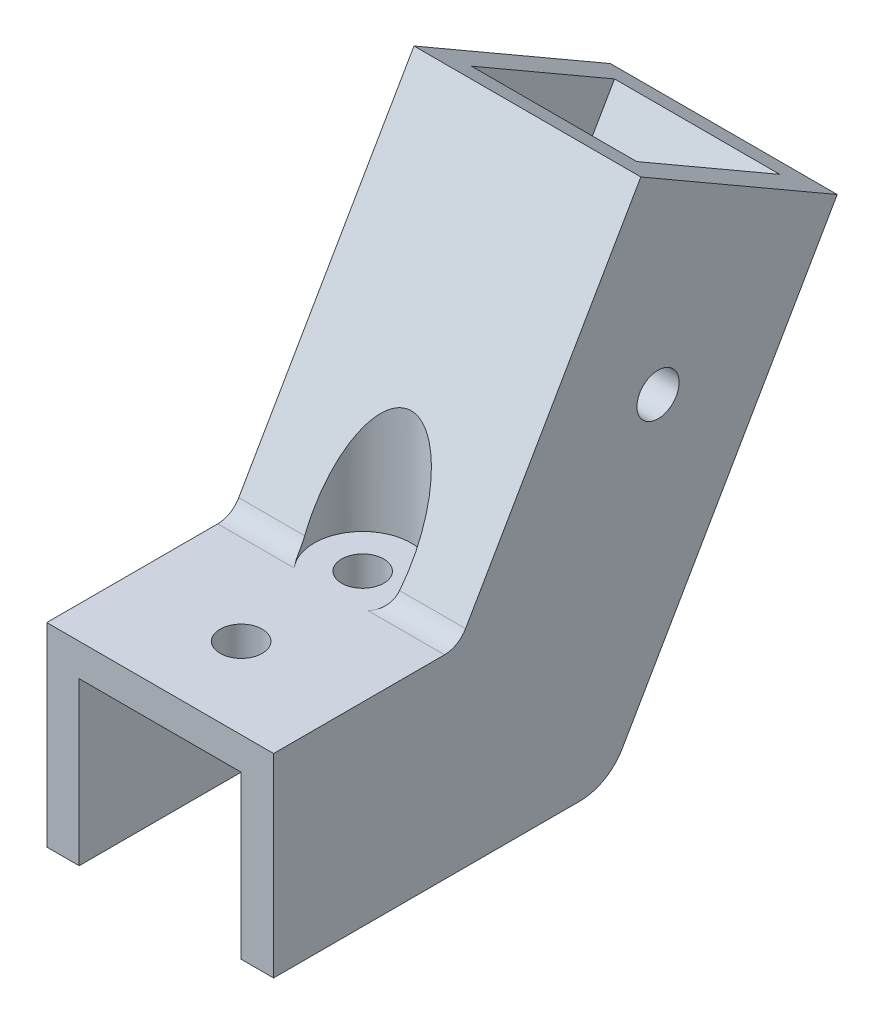
ISO-10303-21;
HEADER;
FILE_DESCRIPTION(('STEP AP214'),'2;1');
FILE_NAME('part.step','',(''),(''),'','','');
FILE_SCHEMA(('AUTOMOTIVE_DESIGN { 1 0 10303 214 1 1 1 1 }'));
ENDSEC;
DATA;
#1=APPLICATION_CONTEXT('core data for automotive mechanical design processes');
#2=APPLICATION_PROTOCOL_DEFINITION('international standard','automotive_design',2000,#1);
#3=PRODUCT_CONTEXT('',#1,'mechanical');
#4=PRODUCT('Part','Part','',(#3));
#5=PRODUCT_RELATED_PRODUCT_CATEGORY('part','',(#4));
#6=PRODUCT_DEFINITION_FORMATION('','',#4);
#7=PRODUCT_DEFINITION_CONTEXT('part definition',#1,'design');
#8=PRODUCT_DEFINITION('design','',#6,#7);
#9=PRODUCT_DEFINITION_SHAPE('','',#8);
#10=(LENGTH_UNIT() NAMED_UNIT(*) SI_UNIT(.MILLI.,.METRE.));
#11=(NAMED_UNIT(*) PLANE_ANGLE_UNIT() SI_UNIT($,.RADIAN.));
#12=(NAMED_UNIT(*) SI_UNIT($,.STERADIAN.) SOLID_ANGLE_UNIT());
#13=UNCERTAINTY_MEASURE_WITH_UNIT(LENGTH_MEASURE(1.E-05),#10,'distance_accuracy_value','');
#14=(GEOMETRIC_REPRESENTATION_CONTEXT(3) GLOBAL_UNCERTAINTY_ASSIGNED_CONTEXT((#13)) GLOBAL_UNIT_ASSIGNED_CONTEXT((#10,
#11,#12)) REPRESENTATION_CONTEXT('',''));
#15=CARTESIAN_POINT('',(0.,0.,0.));
#16=DIRECTION('',(0.,0.,1.));
#17=DIRECTION('',(1.,0.,0.));
#18=AXIS2_PLACEMENT_3D('',#15,#16,#17);
#19=CARTESIAN_POINT('',(0.,0.,16.1658075373095));
#20=DIRECTION('',(0.,0.499999999999998,0.86602540378444));
#21=DIRECTION('',(0.,-0.86602540378444,0.499999999999998));
#22=AXIS2_PLACEMENT_3D('',#19,#20,#21);
#23=PLANE('',#22);
#24=CARTESIAN_POINT('',(14.,3.75128869403571,14.));
#25=DIRECTION('',(0.,0.499999999999998,0.86602540378444));
#26=DIRECTION('',(0.,-0.86602540378444,0.499999999999998));
#27=AXIS2_PLACEMENT_3D('',#24,#25,#26);
#28=ELLIPSE('',#27,12.0000000000001,6.);
#29=CARTESIAN_POINT('',(8.14247779301102,1.50000000000001,15.2997821335251));
#30=VERTEX_POINT('',#29);
#31=CARTESIAN_POINT('',(19.857522206989,1.50000000000001,15.2997821335251));
#32=VERTEX_POINT('',#31);
#33=EDGE_CURVE('E352',#30,#32,#28,.F.);
#34=ORIENTED_EDGE('',*,*,#33,.T.);
#35=DIRECTION('',(1.,0.,0.));
#36=VECTOR('',#35,1.);
#37=CARTESIAN_POINT('',(0.,1.50000000000001,15.2997821335251));
#38=LINE('',#37,#36);
#39=CARTESIAN_POINT('',(28.,1.50000000000001,15.2997821335251));
#40=VERTEX_POINT('',#39);
#41=EDGE_CURVE('E359',#32,#40,#38,.T.);
#42=ORIENTED_EDGE('',*,*,#41,.T.);
#43=DIRECTION('',(0.,-0.86602540378444,0.499999999999998));
#44=VECTOR('',#43,1.);
#45=CARTESIAN_POINT('',(28.,0.,16.1658075373095));
#46=LINE('',#45,#44);
#47=CARTESIAN_POINT('',(28.,38.9711431702998,-6.3341924626904));
#48=VERTEX_POINT('',#47);
#49=EDGE_CURVE('E322',#48,#40,#46,.T.);
#50=ORIENTED_EDGE('',*,*,#49,.F.);
#51=DIRECTION('',(1.,0.,0.));
#52=VECTOR('',#51,1.);
#53=CARTESIAN_POINT('',(0.,38.9711431702998,-6.3341924626904));
#54=LINE('',#53,#52);
#55=CARTESIAN_POINT('',(0.,38.9711431702998,-6.3341924626904));
#56=VERTEX_POINT('',#55);
#57=EDGE_CURVE('E335',#56,#48,#54,.T.);
#58=ORIENTED_EDGE('',*,*,#57,.F.);
#59=DIRECTION('',(0.,-0.86602540378444,0.499999999999998));
#60=VECTOR('',#59,1.);
#61=CARTESIAN_POINT('',(0.,0.,16.1658075373095));
#62=LINE('',#61,#60);
#63=CARTESIAN_POINT('',(0.,1.50000000000001,15.2997821335251));
#64=VERTEX_POINT('',#63);
#65=EDGE_CURVE('E325',#56,#64,#62,.T.);
#66=ORIENTED_EDGE('',*,*,#65,.T.);
#67=DIRECTION('',(1.,0.,0.));
#68=VECTOR('',#67,1.);
#69=CARTESIAN_POINT('',(0.,1.50000000000001,15.2997821335251));
#70=LINE('',#69,#68);
#71=EDGE_CURVE('E356',#64,#30,#70,.T.);
#72=ORIENTED_EDGE('',*,*,#71,.T.);
#73=EDGE_LOOP('',(#34,#42,#50,#58,#66,#72));
#74=FACE_BOUND('',#73,.T.);
#75=ADVANCED_FACE('F37',(#74),#23,.T.);
#76=CARTESIAN_POINT('',(14.,38.9711431702998,14.));
#77=DIRECTION('',(0.,-1.,0.));
#78=DIRECTION('',(0.,0.,-1.));
#79=AXIS2_PLACEMENT_3D('',#76,#77,#78);
#80=CYLINDRICAL_SURFACE('',#79,2.6);
#81=CARTESIAN_POINT('',(14.,-4.,14.));
#82=DIRECTION('',(0.,-1.,0.));
#83=DIRECTION('',(0.,0.,-1.));
#84=AXIS2_PLACEMENT_3D('',#81,#82,#83);
#85=CIRCLE('',#84,2.6);
#86=CARTESIAN_POINT('',(14.,-4.,11.4));
#87=VERTEX_POINT('',#86);
#88=EDGE_CURVE('E484',#87,#87,#85,.T.);
#89=ORIENTED_EDGE('',*,*,#88,.T.);
#90=EDGE_LOOP('',(#89));
#91=FACE_BOUND('',#90,.T.);
#92=CARTESIAN_POINT('',(14.,0.,14.));
#93=DIRECTION('',(0.,-1.,0.));
#94=DIRECTION('',(0.,0.,-1.));
#95=AXIS2_PLACEMENT_3D('',#92,#93,#94);
#96=CIRCLE('',#95,2.6);
#97=CARTESIAN_POINT('',(14.,0.,11.4));
#98=VERTEX_POINT('',#97);
#99=EDGE_CURVE('E224',#98,#98,#96,.T.);
#100=ORIENTED_EDGE('',*,*,#99,.F.);
#101=EDGE_LOOP('',(#100));
#102=FACE_BOUND('',#101,.T.);
#103=ADVANCED_FACE('F397',(#91,#102),#80,.F.);
#104=CARTESIAN_POINT('',(28.,-4.,24.));
#105=DIRECTION('',(0.,1.,0.));
#106=DIRECTION('',(0.,0.,1.));
#107=AXIS2_PLACEMENT_3D('',#104,#105,#106);
#108=PLANE('',#107);
#109=CARTESIAN_POINT('',(14.,-4.,29.));
#110=DIRECTION('',(0.,-1.,0.));
#111=DIRECTION('',(0.,0.,-1.));
#112=AXIS2_PLACEMENT_3D('',#109,#110,#111);
#113=CIRCLE('',#112,2.6);
#114=CARTESIAN_POINT('',(14.,-4.,26.4));
#115=VERTEX_POINT('',#114);
#116=EDGE_CURVE('E482',#115,#115,#113,.T.);
#117=ORIENTED_EDGE('',*,*,#116,.F.);
#118=EDGE_LOOP('',(#117));
#119=FACE_BOUND('',#118,.T.);
#120=ORIENTED_EDGE('',*,*,#88,.F.);
#121=EDGE_LOOP('',(#120));
#122=FACE_BOUND('',#121,.T.);
#123=DIRECTION('',(0.,0.,1.));
#124=VECTOR('',#123,1.);
#125=CARTESIAN_POINT('',(24.,-4.,-30.5829037686547));
#126=LINE('',#125,#124);
#127=CARTESIAN_POINT('',(24.,-4.,-3.45854811567263));
#128=VERTEX_POINT('',#127);
#129=CARTESIAN_POINT('',(24.,-4.,39.));
#130=VERTEX_POINT('',#129);
#131=EDGE_CURVE('E246',#128,#130,#126,.T.);
#132=ORIENTED_EDGE('',*,*,#131,.T.);
#133=DIRECTION('',(1.,0.,0.));
#134=VECTOR('',#133,1.);
#135=CARTESIAN_POINT('',(24.,-4.,39.));
#136=LINE('',#135,#134);
#137=CARTESIAN_POINT('',(4.,-4.,39.));
#138=VERTEX_POINT('',#137);
#139=EDGE_CURVE('E230',#138,#130,#136,.T.);
#140=ORIENTED_EDGE('',*,*,#139,.F.);
#141=DIRECTION('',(0.,0.,1.));
#142=VECTOR('',#141,1.);
#143=CARTESIAN_POINT('',(4.,-4.,-30.5829037686547));
#144=LINE('',#143,#142);
#145=CARTESIAN_POINT('',(4.,-4.,-3.45854811567263));
#146=VERTEX_POINT('',#145);
#147=EDGE_CURVE('E242',#146,#138,#144,.T.);
#148=ORIENTED_EDGE('',*,*,#147,.F.);
#149=DIRECTION('',(1.,0.,0.));
#150=VECTOR('',#149,1.);
#151=CARTESIAN_POINT('',(24.2,-4.,-3.45854811567263));
#152=LINE('',#151,#150);
#153=EDGE_CURVE('E348',#146,#128,#152,.T.);
#154=ORIENTED_EDGE('',*,*,#153,.T.);
#155=EDGE_LOOP('',(#132,#140,#148,#154));
#156=FACE_BOUND('',#155,.T.);
#157=ADVANCED_FACE('F400',(#119,#122,#156),#108,.F.);
#158=CARTESIAN_POINT('',(28.,-24.,4.));
#159=DIRECTION('',(0.,1.,0.));
#160=DIRECTION('',(0.,0.,1.));
#161=AXIS2_PLACEMENT_3D('',#158,#159,#160);
#162=PLANE('',#161);
#163=DIRECTION('',(0.,0.,-1.));
#164=VECTOR('',#163,1.);
#165=CARTESIAN_POINT('',(0.,-24.,4.));
#166=LINE('',#165,#164);
#167=CARTESIAN_POINT('',(0.,-24.,39.));
#168=VERTEX_POINT('',#167);
#169=CARTESIAN_POINT('',(0.,-24.,1.1547005383792));
#170=VERTEX_POINT('',#169);
#171=EDGE_CURVE('E191',#168,#170,#166,.T.);
#172=ORIENTED_EDGE('',*,*,#171,.T.);
#173=DIRECTION('',(1.,0.,0.));
#174=VECTOR('',#173,1.);
#175=CARTESIAN_POINT('',(4.,-24.,1.1547005383792));
#176=LINE('',#175,#174);
#177=CARTESIAN_POINT('',(4.,-24.,1.1547005383792));
#178=VERTEX_POINT('',#177);
#179=EDGE_CURVE('E500',#170,#178,#176,.T.);
#180=ORIENTED_EDGE('',*,*,#179,.T.);
#181=DIRECTION('',(0.,0.,1.));
#182=VECTOR('',#181,1.);
#183=CARTESIAN_POINT('',(4.,-24.,-30.5829037686547));
#184=LINE('',#183,#182);
#185=CARTESIAN_POINT('',(4.,-24.,39.));
#186=VERTEX_POINT('',#185);
#187=EDGE_CURVE('E210',#178,#186,#184,.T.);
#188=ORIENTED_EDGE('',*,*,#187,.T.);
#189=DIRECTION('',(1.,0.,0.));
#190=VECTOR('',#189,1.);
#191=CARTESIAN_POINT('',(4.,-24.,39.));
#192=LINE('',#191,#190);
#193=EDGE_CURVE('E207',#168,#186,#192,.T.);
#194=ORIENTED_EDGE('',*,*,#193,.F.);
#195=EDGE_LOOP('',(#172,#180,#188,#194));
#196=FACE_BOUND('',#195,.T.);
#197=ADVANCED_FACE('F208',(#196),#162,.F.);
#198=CARTESIAN_POINT('',(28.,0.,0.));
#199=DIRECTION('',(0.,-1.,0.));
#200=DIRECTION('',(0.,0.,-1.));
#201=AXIS2_PLACEMENT_3D('',#198,#199,#200);
#202=PLANE('',#201);
#203=DIRECTION('',(0.,0.,1.));
#204=VECTOR('',#203,1.);
#205=CARTESIAN_POINT('',(28.,0.,0.));
#206=LINE('',#205,#204);
#207=CARTESIAN_POINT('',(28.,0.,17.8978583448784));
#208=VERTEX_POINT('',#207);
#209=CARTESIAN_POINT('',(28.,0.,39.));
#210=VERTEX_POINT('',#209);
#211=EDGE_CURVE('E203',#208,#210,#206,.T.);
#212=ORIENTED_EDGE('',*,*,#211,.F.);
#213=DIRECTION('',(1.,0.,0.));
#214=VECTOR('',#213,1.);
#215=CARTESIAN_POINT('',(28.,0.,17.8978583448784));
#216=LINE('',#215,#214);
#217=CARTESIAN_POINT('',(18.5614362127801,0.,17.8978583448784));
#218=VERTEX_POINT('',#217);
#219=EDGE_CURVE('E364',#208,#218,#216,.F.);
#220=ORIENTED_EDGE('',*,*,#219,.T.);
#221=CARTESIAN_POINT('',(14.,0.,14.));
#222=DIRECTION('',(0.,1.,0.));
#223=DIRECTION('',(0.,0.,1.));
#224=AXIS2_PLACEMENT_3D('',#221,#222,#223);
#225=CIRCLE('',#224,6.);
#226=CARTESIAN_POINT('',(9.43856378721987,0.,17.8978583448784));
#227=VERTEX_POINT('',#226);
#228=EDGE_CURVE('E488',#218,#227,#225,.T.);
#229=ORIENTED_EDGE('',*,*,#228,.T.);
#230=DIRECTION('',(1.,0.,0.));
#231=VECTOR('',#230,1.);
#232=CARTESIAN_POINT('',(28.,0.,17.8978583448784));
#233=LINE('',#232,#231);
#234=CARTESIAN_POINT('',(0.,0.,17.8978583448784));
#235=VERTEX_POINT('',#234);
#236=EDGE_CURVE('E362',#227,#235,#233,.F.);
#237=ORIENTED_EDGE('',*,*,#236,.T.);
#238=DIRECTION('',(0.,0.,1.));
#239=VECTOR('',#238,1.);
#240=CARTESIAN_POINT('',(0.,0.,0.));
#241=LINE('',#240,#239);
#242=CARTESIAN_POINT('',(0.,0.,39.));
#243=VERTEX_POINT('',#242);
#244=EDGE_CURVE('E204',#235,#243,#241,.T.);
#245=ORIENTED_EDGE('',*,*,#244,.T.);
#246=DIRECTION('',(-1.,0.,0.));
#247=VECTOR('',#246,1.);
#248=CARTESIAN_POINT('',(0.,0.,39.));
#249=LINE('',#248,#247);
#250=EDGE_CURVE('E220',#210,#243,#249,.T.);
#251=ORIENTED_EDGE('',*,*,#250,.F.);
#252=EDGE_LOOP('',(#212,#220,#229,#237,#245,#251));
#253=FACE_BOUND('',#252,.T.);
#254=CARTESIAN_POINT('',(14.,0.,29.));
#255=DIRECTION('',(0.,-1.,0.));
#256=DIRECTION('',(0.,0.,-1.));
#257=AXIS2_PLACEMENT_3D('',#254,#255,#256);
#258=CIRCLE('',#257,2.6);
#259=CARTESIAN_POINT('',(14.,0.,26.4));
#260=VERTEX_POINT('',#259);
#261=EDGE_CURVE('E221',#260,#260,#258,.T.);
#262=ORIENTED_EDGE('',*,*,#261,.T.);
#263=EDGE_LOOP('',(#262));
#264=FACE_BOUND('',#263,.T.);
#265=ORIENTED_EDGE('',*,*,#99,.T.);
#266=EDGE_LOOP('',(#265));
#267=FACE_BOUND('',#266,.T.);
#268=ADVANCED_FACE('F465',(#253,#264,#267),#202,.F.);
#269=DIRECTION('',(0.,0.,1.));
#270=VECTOR('',#269,1.);
#271=CARTESIAN_POINT('',(24.,-24.,-30.5829037686547));
#272=LINE('',#271,#270);
#273=CARTESIAN_POINT('',(24.,-24.,1.1547005383792));
#274=VERTEX_POINT('',#273);
#275=CARTESIAN_POINT('',(24.,-24.,39.));
#276=VERTEX_POINT('',#275);
#277=EDGE_CURVE('E248',#274,#276,#272,.T.);
#278=ORIENTED_EDGE('',*,*,#277,.F.);
#279=DIRECTION('',(1.,0.,0.));
#280=VECTOR('',#279,1.);
#281=CARTESIAN_POINT('',(28.,-24.,1.1547005383792));
#282=LINE('',#281,#280);
#283=CARTESIAN_POINT('',(28.,-24.,1.1547005383792));
#284=VERTEX_POINT('',#283);
#285=EDGE_CURVE('E510',#274,#284,#282,.T.);
#286=ORIENTED_EDGE('',*,*,#285,.T.);
#287=DIRECTION('',(0.,0.,-1.));
#288=VECTOR('',#287,1.);
#289=CARTESIAN_POINT('',(28.,-24.,4.));
#290=LINE('',#289,#288);
#291=CARTESIAN_POINT('',(28.,-24.,39.));
#292=VERTEX_POINT('',#291);
#293=EDGE_CURVE('E340',#292,#284,#290,.T.);
#294=ORIENTED_EDGE('',*,*,#293,.F.);
#295=DIRECTION('',(1.,0.,0.));
#296=VECTOR('',#295,1.);
#297=CARTESIAN_POINT('',(28.,-24.,39.));
#298=LINE('',#297,#296);
#299=EDGE_CURVE('E236',#276,#292,#298,.T.);
#300=ORIENTED_EDGE('',*,*,#299,.F.);
#301=EDGE_LOOP('',(#278,#286,#294,#300));
#302=FACE_BOUND('',#301,.T.);
#303=ADVANCED_FACE('F458',(#302),#162,.F.);
#304=CARTESIAN_POINT('',(28.,0.,0.));
#305=DIRECTION('',(1.,0.,0.));
#306=DIRECTION('',(0.,0.,-1.));
#307=AXIS2_PLACEMENT_3D('',#304,#305,#306);
#308=PLANE('',#307);
#309=CARTESIAN_POINT('',(28.,14.6506350946111,-8.45854811567263));
#310=DIRECTION('',(1.,0.,0.));
#311=DIRECTION('',(0.,0.,-1.));
#312=AXIS2_PLACEMENT_3D('',#309,#310,#311);
#313=CIRCLE('',#312,2.6);
#314=CARTESIAN_POINT('',(28.,14.6506350946111,-11.0585481156726));
#315=VERTEX_POINT('',#314);
#316=EDGE_CURVE('E267',#315,#315,#313,.T.);
#317=ORIENTED_EDGE('',*,*,#316,.F.);
#318=EDGE_LOOP('',(#317));
#319=FACE_BOUND('',#318,.T.);
#320=ORIENTED_EDGE('',*,*,#293,.T.);
#321=CARTESIAN_POINT('',(28.,-18.,1.1547005383792));
#322=DIRECTION('',(1.,0.,0.));
#323=DIRECTION('',(0.,0.,-1.));
#324=AXIS2_PLACEMENT_3D('',#321,#322,#323);
#325=CIRCLE('',#324,6.);
#326=CARTESIAN_POINT('',(28.,-21.,-4.04145188432744));
#327=VERTEX_POINT('',#326);
#328=EDGE_CURVE('E45',#284,#327,#325,.T.);
#329=ORIENTED_EDGE('',*,*,#328,.T.);
#330=DIRECTION('',(0.,0.86602540378444,-0.499999999999998));
#331=VECTOR('',#330,1.);
#332=CARTESIAN_POINT('',(28.,-24.,-2.30940107675857));
#333=LINE('',#332,#331);
#334=CARTESIAN_POINT('',(28.,24.9711431702999,-30.5829037686547));
#335=VERTEX_POINT('',#334);
#336=EDGE_CURVE('E312',#327,#335,#333,.T.);
#337=ORIENTED_EDGE('',*,*,#336,.T.);
#338=DIRECTION('',(0.,0.499999999999998,0.86602540378444));
#339=VECTOR('',#338,1.);
#340=CARTESIAN_POINT('',(28.,38.9711431702998,-6.3341924626904));
#341=LINE('',#340,#339);
#342=EDGE_CURVE('E330',#335,#48,#341,.T.);
#343=ORIENTED_EDGE('',*,*,#342,.T.);
#344=ORIENTED_EDGE('',*,*,#49,.T.);
#345=CARTESIAN_POINT('',(28.,3.,17.8978583448784));
#346=DIRECTION('',(1.,0.,0.));
#347=DIRECTION('',(0.,0.,-1.));
#348=AXIS2_PLACEMENT_3D('',#345,#346,#347);
#349=CIRCLE('',#348,3.);
#350=EDGE_CURVE('E367',#40,#208,#349,.F.);
#351=ORIENTED_EDGE('',*,*,#350,.T.);
#352=ORIENTED_EDGE('',*,*,#211,.T.);
#353=DIRECTION('',(0.,1.,0.));
#354=VECTOR('',#353,1.);
#355=CARTESIAN_POINT('',(28.,0.,39.));
#356=LINE('',#355,#354);
#357=EDGE_CURVE('E239',#292,#210,#356,.T.);
#358=ORIENTED_EDGE('',*,*,#357,.F.);
#359=EDGE_LOOP('',(#320,#329,#337,#343,#344,#351,#352,#358));
#360=FACE_BOUND('',#359,.T.);
#361=ADVANCED_FACE('F455',(#319,#360),#308,.T.);
#362=CARTESIAN_POINT('',(0.,0.,0.));
#363=DIRECTION('',(1.,0.,0.));
#364=DIRECTION('',(0.,0.,-1.));
#365=AXIS2_PLACEMENT_3D('',#362,#363,#364);
#366=PLANE('',#365);
#367=CARTESIAN_POINT('',(0.,14.6506350946111,-8.45854811567263));
#368=DIRECTION('',(1.,0.,0.));
#369=DIRECTION('',(0.,0.,-1.));
#370=AXIS2_PLACEMENT_3D('',#367,#368,#369);
#371=CIRCLE('',#370,2.6);
#372=CARTESIAN_POINT('',(0.,14.6506350946111,-11.0585481156726));
#373=VERTEX_POINT('',#372);
#374=EDGE_CURVE('E268',#373,#373,#371,.T.);
#375=ORIENTED_EDGE('',*,*,#374,.T.);
#376=EDGE_LOOP('',(#375));
#377=FACE_BOUND('',#376,.T.);
#378=DIRECTION('',(0.,0.86602540378444,-0.499999999999998));
#379=VECTOR('',#378,1.);
#380=CARTESIAN_POINT('',(0.,-24.,-2.30940107675857));
#381=LINE('',#380,#379);
#382=CARTESIAN_POINT('',(0.,-21.,-4.04145188432744));
#383=VERTEX_POINT('',#382);
#384=CARTESIAN_POINT('',(0.,24.9711431702999,-30.5829037686547));
#385=VERTEX_POINT('',#384);
#386=EDGE_CURVE('E319',#383,#385,#381,.T.);
#387=ORIENTED_EDGE('',*,*,#386,.F.);
#388=CARTESIAN_POINT('',(0.,-18.,1.1547005383792));
#389=DIRECTION('',(1.,0.,0.));
#390=DIRECTION('',(0.,0.,-1.));
#391=AXIS2_PLACEMENT_3D('',#388,#389,#390);
#392=CIRCLE('',#391,6.);
#393=EDGE_CURVE('E199',#383,#170,#392,.F.);
#394=ORIENTED_EDGE('',*,*,#393,.T.);
#395=ORIENTED_EDGE('',*,*,#171,.F.);
#396=DIRECTION('',(0.,-1.,0.));
#397=VECTOR('',#396,1.);
#398=CARTESIAN_POINT('',(0.,-24.,39.));
#399=LINE('',#398,#397);
#400=EDGE_CURVE('E197',#243,#168,#399,.T.);
#401=ORIENTED_EDGE('',*,*,#400,.F.);
#402=ORIENTED_EDGE('',*,*,#244,.F.);
#403=CARTESIAN_POINT('',(0.,3.,17.8978583448784));
#404=DIRECTION('',(1.,0.,0.));
#405=DIRECTION('',(0.,0.,-1.));
#406=AXIS2_PLACEMENT_3D('',#403,#404,#405);
#407=CIRCLE('',#406,3.);
#408=EDGE_CURVE('E496',#235,#64,#407,.T.);
#409=ORIENTED_EDGE('',*,*,#408,.T.);
#410=ORIENTED_EDGE('',*,*,#65,.F.);
#411=DIRECTION('',(0.,0.499999999999998,0.86602540378444));
#412=VECTOR('',#411,1.);
#413=CARTESIAN_POINT('',(0.,38.9711431702998,-6.3341924626904));
#414=LINE('',#413,#412);
#415=EDGE_CURVE('E321',#385,#56,#414,.T.);
#416=ORIENTED_EDGE('',*,*,#415,.F.);
#417=EDGE_LOOP('',(#387,#394,#395,#401,#402,#409,#410,#416));
#418=FACE_BOUND('',#417,.T.);
#419=ADVANCED_FACE('F194',(#377,#418),#366,.F.);
#420=CARTESIAN_POINT('',(0.,38.9711431702998,-6.3341924626904));
#421=DIRECTION('',(0.,0.86602540378444,-0.499999999999998));
#422=DIRECTION('',(0.,0.499999999999998,0.86602540378444));
#423=AXIS2_PLACEMENT_3D('',#420,#421,#422);
#424=PLANE('',#423);
#425=DIRECTION('',(0.,0.499999999999998,0.86602540378444));
#426=VECTOR('',#425,1.);
#427=CARTESIAN_POINT('',(3.8,26.8711431702999,-27.2920072342739));
#428=LINE('',#427,#426);
#429=CARTESIAN_POINT('',(3.8,26.8711431702999,-27.2920072342739));
#430=VERTEX_POINT('',#429);
#431=CARTESIAN_POINT('',(3.8,37.0711431702998,-9.62508899707126));
#432=VERTEX_POINT('',#431);
#433=EDGE_CURVE('E290',#430,#432,#428,.T.);
#434=ORIENTED_EDGE('',*,*,#433,.F.);
#435=DIRECTION('',(-1.,0.,0.));
#436=VECTOR('',#435,1.);
#437=CARTESIAN_POINT('',(3.8,26.8711431702999,-27.2920072342739));
#438=LINE('',#437,#436);
#439=CARTESIAN_POINT('',(24.2,26.8711431702999,-27.2920072342739));
#440=VERTEX_POINT('',#439);
#441=EDGE_CURVE('E294',#440,#430,#438,.T.);
#442=ORIENTED_EDGE('',*,*,#441,.F.);
#443=DIRECTION('',(0.,-0.499999999999998,-0.86602540378444));
#444=VECTOR('',#443,1.);
#445=CARTESIAN_POINT('',(24.2,26.8711431702999,-27.2920072342739));
#446=LINE('',#445,#444);
#447=CARTESIAN_POINT('',(24.2,37.0711431702998,-9.62508899707127));
#448=VERTEX_POINT('',#447);
#449=EDGE_CURVE('E305',#448,#440,#446,.T.);
#450=ORIENTED_EDGE('',*,*,#449,.F.);
#451=DIRECTION('',(1.,0.,0.));
#452=VECTOR('',#451,1.);
#453=CARTESIAN_POINT('',(24.2,37.0711431702998,-9.62508899707127));
#454=LINE('',#453,#452);
#455=EDGE_CURVE('E302',#432,#448,#454,.T.);
#456=ORIENTED_EDGE('',*,*,#455,.F.);
#457=EDGE_LOOP('',(#434,#442,#450,#456));
#458=FACE_BOUND('',#457,.T.);
#459=ORIENTED_EDGE('',*,*,#342,.F.);
#460=DIRECTION('',(1.,0.,0.));
#461=VECTOR('',#460,1.);
#462=CARTESIAN_POINT('',(0.,24.9711431702999,-30.5829037686547));
#463=LINE('',#462,#461);
#464=EDGE_CURVE('E328',#385,#335,#463,.T.);
#465=ORIENTED_EDGE('',*,*,#464,.F.);
#466=ORIENTED_EDGE('',*,*,#415,.T.);
#467=ORIENTED_EDGE('',*,*,#57,.T.);
#468=EDGE_LOOP('',(#459,#465,#466,#467));
#469=FACE_BOUND('',#468,.T.);
#470=ADVANCED_FACE('F448',(#458,#469),#424,.T.);
#471=CARTESIAN_POINT('',(0.,-24.,-2.30940107675857));
#472=DIRECTION('',(0.,-0.499999999999998,-0.86602540378444));
#473=DIRECTION('',(0.,0.86602540378444,-0.499999999999998));
#474=AXIS2_PLACEMENT_3D('',#471,#472,#473);
#475=PLANE('',#474);
#476=DIRECTION('',(0.,0.86602540378444,-0.499999999999998));
#477=VECTOR('',#476,1.);
#478=CARTESIAN_POINT('',(4.,-24.,-2.30940107675857));
#479=LINE('',#478,#477);
#480=CARTESIAN_POINT('',(4.,-21.,-4.04145188432744));
#481=VERTEX_POINT('',#480);
#482=CARTESIAN_POINT('',(4.,-4.,-13.856406460551));
#483=VERTEX_POINT('',#482);
#484=EDGE_CURVE('E265',#481,#483,#479,.T.);
#485=ORIENTED_EDGE('',*,*,#484,.F.);
#486=DIRECTION('',(1.,0.,0.));
#487=VECTOR('',#486,1.);
#488=CARTESIAN_POINT('',(0.,-21.,-4.04145188432744));
#489=LINE('',#488,#487);
#490=EDGE_CURVE('E507',#481,#383,#489,.F.);
#491=ORIENTED_EDGE('',*,*,#490,.T.);
#492=ORIENTED_EDGE('',*,*,#386,.T.);
#493=ORIENTED_EDGE('',*,*,#464,.T.);
#494=ORIENTED_EDGE('',*,*,#336,.F.);
#495=DIRECTION('',(1.,0.,0.));
#496=VECTOR('',#495,1.);
#497=CARTESIAN_POINT('',(24.,-21.,-4.04145188432744));
#498=LINE('',#497,#496);
#499=CARTESIAN_POINT('',(24.,-21.,-4.04145188432744));
#500=VERTEX_POINT('',#499);
#501=EDGE_CURVE('E505',#327,#500,#498,.F.);
#502=ORIENTED_EDGE('',*,*,#501,.T.);
#503=DIRECTION('',(0.,-0.86602540378444,0.499999999999998));
#504=VECTOR('',#503,1.);
#505=CARTESIAN_POINT('',(24.,-24.,-2.30940107675857));
#506=LINE('',#505,#504);
#507=CARTESIAN_POINT('',(24.,-4.,-13.856406460551));
#508=VERTEX_POINT('',#507);
#509=EDGE_CURVE('E254',#508,#500,#506,.T.);
#510=ORIENTED_EDGE('',*,*,#509,.F.);
#511=DIRECTION('',(1.,0.,0.));
#512=VECTOR('',#511,1.);
#513=CARTESIAN_POINT('',(0.,-4.,-13.856406460551));
#514=LINE('',#513,#512);
#515=EDGE_CURVE('E259',#483,#508,#514,.T.);
#516=ORIENTED_EDGE('',*,*,#515,.F.);
#517=EDGE_LOOP('',(#485,#491,#492,#493,#494,#502,#510,#516));
#518=FACE_BOUND('',#517,.T.);
#519=ADVANCED_FACE('F443',(#518),#475,.T.);
#520=CARTESIAN_POINT('',(3.8,0.890381056766674,-12.2920072342739));
#521=DIRECTION('',(-1.,0.,0.));
#522=DIRECTION('',(0.,0.,1.));
#523=AXIS2_PLACEMENT_3D('',#520,#521,#522);
#524=PLANE('',#523);
#525=CARTESIAN_POINT('',(3.8,14.6506350946111,-8.45854811567263));
#526=DIRECTION('',(-1.,0.,0.));
#527=DIRECTION('',(0.,0.,1.));
#528=AXIS2_PLACEMENT_3D('',#525,#526,#527);
#529=CIRCLE('',#528,2.6);
#530=CARTESIAN_POINT('',(3.8,14.6506350946111,-5.85854811567262));
#531=VERTEX_POINT('',#530);
#532=EDGE_CURVE('E274',#531,#531,#529,.T.);
#533=ORIENTED_EDGE('',*,*,#532,.T.);
#534=EDGE_LOOP('',(#533));
#535=FACE_BOUND('',#534,.T.);
#536=ORIENTED_EDGE('',*,*,#433,.T.);
#537=DIRECTION('',(0.,0.86602540378444,-0.499999999999998));
#538=VECTOR('',#537,1.);
#539=CARTESIAN_POINT('',(3.8,11.0903810567666,5.37491100292866));
#540=LINE('',#539,#538);
#541=CARTESIAN_POINT('',(3.8,11.0903810567666,5.37491100292866));
#542=VERTEX_POINT('',#541);
#543=EDGE_CURVE('E300',#542,#432,#540,.T.);
#544=ORIENTED_EDGE('',*,*,#543,.F.);
#545=DIRECTION('',(0.,0.499999999999998,0.86602540378444));
#546=VECTOR('',#545,1.);
#547=CARTESIAN_POINT('',(3.8,0.890381056766674,-12.2920072342739));
#548=LINE('',#547,#546);
#549=CARTESIAN_POINT('',(3.8,5.99038105676665,-3.45854811567263));
#550=VERTEX_POINT('',#549);
#551=EDGE_CURVE('E291',#550,#542,#548,.T.);
#552=ORIENTED_EDGE('',*,*,#551,.F.);
#553=DIRECTION('',(0.,-1.,0.));
#554=VECTOR('',#553,1.);
#555=CARTESIAN_POINT('',(3.8,5.99038105676665,-3.45854811567263));
#556=LINE('',#555,#554);
#557=CARTESIAN_POINT('',(3.8,-14.4096189432334,-3.45854811567263));
#558=VERTEX_POINT('',#557);
#559=EDGE_CURVE('E277',#550,#558,#556,.T.);
#560=ORIENTED_EDGE('',*,*,#559,.T.);
#561=DIRECTION('',(0.,0.86602540378444,-0.499999999999998));
#562=VECTOR('',#561,1.);
#563=CARTESIAN_POINT('',(3.8,0.890381056766674,-12.2920072342739));
#564=LINE('',#563,#562);
#565=EDGE_CURVE('E310',#558,#430,#564,.T.);
#566=ORIENTED_EDGE('',*,*,#565,.T.);
#567=EDGE_LOOP('',(#536,#544,#552,#560,#566));
#568=FACE_BOUND('',#567,.T.);
#569=ADVANCED_FACE('F433',(#535,#568),#524,.F.);
#570=CARTESIAN_POINT('',(3.8,0.890381056766674,-12.2920072342739));
#571=DIRECTION('',(0.,-0.499999999999998,-0.86602540378444));
#572=DIRECTION('',(0.,0.86602540378444,-0.499999999999998));
#573=AXIS2_PLACEMENT_3D('',#570,#571,#572);
#574=PLANE('',#573);
#575=DIRECTION('',(-1.,0.,0.));
#576=VECTOR('',#575,1.);
#577=CARTESIAN_POINT('',(24.2,-14.4096189432335,-3.45854811567264));
#578=LINE('',#577,#576);
#579=CARTESIAN_POINT('',(4.,-14.4096189432334,-3.45854811567263));
#580=VERTEX_POINT('',#579);
#581=EDGE_CURVE('E281',#580,#558,#578,.T.);
#582=ORIENTED_EDGE('',*,*,#581,.F.);
#583=DIRECTION('',(0.,0.86602540378444,-0.499999999999998));
#584=VECTOR('',#583,1.);
#585=CARTESIAN_POINT('',(4.,0.890381056766674,-12.2920072342739));
#586=LINE('',#585,#584);
#587=CARTESIAN_POINT('',(4.,-4.,-9.46854441470985));
#588=VERTEX_POINT('',#587);
#589=EDGE_CURVE('E262',#580,#588,#586,.T.);
#590=ORIENTED_EDGE('',*,*,#589,.T.);
#591=DIRECTION('',(1.,0.,0.));
#592=VECTOR('',#591,1.);
#593=CARTESIAN_POINT('',(3.8,-4.,-9.46854441470985));
#594=LINE('',#593,#592);
#595=CARTESIAN_POINT('',(24.,-4.,-9.46854441470985));
#596=VERTEX_POINT('',#595);
#597=EDGE_CURVE('E256',#588,#596,#594,.T.);
#598=ORIENTED_EDGE('',*,*,#597,.T.);
#599=DIRECTION('',(0.,-0.86602540378444,0.499999999999998));
#600=VECTOR('',#599,1.);
#601=CARTESIAN_POINT('',(24.,0.890381056766676,-12.2920072342739));
#602=LINE('',#601,#600);
#603=CARTESIAN_POINT('',(24.,-14.4096189432334,-3.45854811567264));
#604=VERTEX_POINT('',#603);
#605=EDGE_CURVE('E251',#596,#604,#602,.T.);
#606=ORIENTED_EDGE('',*,*,#605,.T.);
#607=CARTESIAN_POINT('',(24.2,-14.4096189432335,-3.45854811567264));
#608=VERTEX_POINT('',#607);
#609=EDGE_CURVE('E284',#608,#604,#578,.T.);
#610=ORIENTED_EDGE('',*,*,#609,.F.);
#611=DIRECTION('',(0.,0.86602540378444,-0.499999999999998));
#612=VECTOR('',#611,1.);
#613=CARTESIAN_POINT('',(24.2,0.890381056766674,-12.2920072342739));
#614=LINE('',#613,#612);
#615=EDGE_CURVE('E313',#608,#440,#614,.T.);
#616=ORIENTED_EDGE('',*,*,#615,.T.);
#617=ORIENTED_EDGE('',*,*,#441,.T.);
#618=ORIENTED_EDGE('',*,*,#565,.F.);
#619=EDGE_LOOP('',(#582,#590,#598,#606,#610,#616,#617,#618));
#620=FACE_BOUND('',#619,.T.);
#621=ADVANCED_FACE('F429',(#620),#574,.F.);
#622=CARTESIAN_POINT('',(24.2,0.890381056766674,-12.2920072342739));
#623=DIRECTION('',(1.,0.,0.));
#624=DIRECTION('',(0.,0.,-1.));
#625=AXIS2_PLACEMENT_3D('',#622,#623,#624);
#626=PLANE('',#625);
#627=CARTESIAN_POINT('',(24.2,14.6506350946111,-8.45854811567263));
#628=DIRECTION('',(1.,0.,0.));
#629=DIRECTION('',(0.,0.,-1.));
#630=AXIS2_PLACEMENT_3D('',#627,#628,#629);
#631=CIRCLE('',#630,2.6);
#632=CARTESIAN_POINT('',(24.2,14.6506350946111,-11.0585481156726));
#633=VERTEX_POINT('',#632);
#634=EDGE_CURVE('E271',#633,#633,#631,.T.);
#635=ORIENTED_EDGE('',*,*,#634,.T.);
#636=EDGE_LOOP('',(#635));
#637=FACE_BOUND('',#636,.T.);
#638=ORIENTED_EDGE('',*,*,#449,.T.);
#639=ORIENTED_EDGE('',*,*,#615,.F.);
#640=DIRECTION('',(0.,-1.,0.));
#641=VECTOR('',#640,1.);
#642=CARTESIAN_POINT('',(24.2,5.99038105676665,-3.45854811567263));
#643=LINE('',#642,#641);
#644=CARTESIAN_POINT('',(24.2,5.99038105676665,-3.45854811567263));
#645=VERTEX_POINT('',#644);
#646=EDGE_CURVE('E278',#645,#608,#643,.T.);
#647=ORIENTED_EDGE('',*,*,#646,.F.);
#648=DIRECTION('',(0.,-0.499999999999998,-0.86602540378444));
#649=VECTOR('',#648,1.);
#650=CARTESIAN_POINT('',(24.2,0.890381056766674,-12.2920072342739));
#651=LINE('',#650,#649);
#652=CARTESIAN_POINT('',(24.2,11.0903810567666,5.37491100292866));
#653=VERTEX_POINT('',#652);
#654=EDGE_CURVE('E297',#653,#645,#651,.T.);
#655=ORIENTED_EDGE('',*,*,#654,.F.);
#656=DIRECTION('',(0.,0.86602540378444,-0.499999999999998));
#657=VECTOR('',#656,1.);
#658=CARTESIAN_POINT('',(24.2,11.0903810567666,5.37491100292866));
#659=LINE('',#658,#657);
#660=EDGE_CURVE('E315',#653,#448,#659,.T.);
#661=ORIENTED_EDGE('',*,*,#660,.T.);
#662=EDGE_LOOP('',(#638,#639,#647,#655,#661));
#663=FACE_BOUND('',#662,.T.);
#664=ADVANCED_FACE('F432',(#637,#663),#626,.F.);
#665=CARTESIAN_POINT('',(24.2,11.0903810567666,5.37491100292866));
#666=DIRECTION('',(0.,0.499999999999998,0.86602540378444));
#667=DIRECTION('',(0.,-0.86602540378444,0.499999999999998));
#668=AXIS2_PLACEMENT_3D('',#665,#666,#667);
#669=PLANE('',#668);
#670=ORIENTED_EDGE('',*,*,#455,.T.);
#671=ORIENTED_EDGE('',*,*,#660,.F.);
#672=DIRECTION('',(1.,0.,0.));
#673=VECTOR('',#672,1.);
#674=CARTESIAN_POINT('',(24.2,11.0903810567666,5.37491100292866));
#675=LINE('',#674,#673);
#676=EDGE_CURVE('E293',#542,#653,#675,.T.);
#677=ORIENTED_EDGE('',*,*,#676,.F.);
#678=ORIENTED_EDGE('',*,*,#543,.T.);
#679=EDGE_LOOP('',(#670,#671,#677,#678));
#680=FACE_BOUND('',#679,.T.);
#681=ADVANCED_FACE('F427',(#680),#669,.F.);
#682=CARTESIAN_POINT('',(0.,5.99038105676665,-3.45854811567263));
#683=DIRECTION('',(0.,-0.86602540378444,0.499999999999998));
#684=DIRECTION('',(0.,-0.499999999999998,-0.86602540378444));
#685=AXIS2_PLACEMENT_3D('',#682,#683,#684);
#686=PLANE('',#685);
#687=ORIENTED_EDGE('',*,*,#654,.T.);
#688=DIRECTION('',(-1.,0.,0.));
#689=VECTOR('',#688,1.);
#690=CARTESIAN_POINT('',(24.2,5.99038105676665,-3.45854811567263));
#691=LINE('',#690,#689);
#692=EDGE_CURVE('E287',#645,#550,#691,.T.);
#693=ORIENTED_EDGE('',*,*,#692,.T.);
#694=ORIENTED_EDGE('',*,*,#551,.T.);
#695=ORIENTED_EDGE('',*,*,#676,.T.);
#696=EDGE_LOOP('',(#687,#693,#694,#695));
#697=FACE_BOUND('',#696,.T.);
#698=ADVANCED_FACE('F423',(#697),#686,.F.);
#699=CARTESIAN_POINT('',(24.2,5.99038105676665,-3.45854811567263));
#700=DIRECTION('',(0.,0.,-1.));
#701=DIRECTION('',(-1.,0.,0.));
#702=AXIS2_PLACEMENT_3D('',#699,#700,#701);
#703=PLANE('',#702);
#704=DIRECTION('',(0.,1.,0.));
#705=VECTOR('',#704,1.);
#706=CARTESIAN_POINT('',(4.,5.99038105676665,-3.45854811567263));
#707=LINE('',#706,#705);
#708=EDGE_CURVE('E351',#580,#146,#707,.T.);
#709=ORIENTED_EDGE('',*,*,#708,.F.);
#710=ORIENTED_EDGE('',*,*,#581,.T.);
#711=ORIENTED_EDGE('',*,*,#559,.F.);
#712=ORIENTED_EDGE('',*,*,#692,.F.);
#713=ORIENTED_EDGE('',*,*,#646,.T.);
#714=ORIENTED_EDGE('',*,*,#609,.T.);
#715=DIRECTION('',(0.,-1.,0.));
#716=VECTOR('',#715,1.);
#717=CARTESIAN_POINT('',(24.,5.99038105676665,-3.45854811567263));
#718=LINE('',#717,#716);
#719=EDGE_CURVE('E343',#128,#604,#718,.T.);
#720=ORIENTED_EDGE('',*,*,#719,.F.);
#721=ORIENTED_EDGE('',*,*,#153,.F.);
#722=EDGE_LOOP('',(#709,#710,#711,#712,#713,#714,#720,#721));
#723=FACE_BOUND('',#722,.T.);
#724=ADVANCED_FACE('F420',(#723),#703,.T.);
#725=CARTESIAN_POINT('',(0.,14.6506350946111,-8.45854811567263));
#726=DIRECTION('',(1.,0.,0.));
#727=DIRECTION('',(0.,0.,-1.));
#728=AXIS2_PLACEMENT_3D('',#725,#726,#727);
#729=CYLINDRICAL_SURFACE('',#728,2.6);
#730=ORIENTED_EDGE('',*,*,#316,.T.);
#731=EDGE_LOOP('',(#730));
#732=FACE_BOUND('',#731,.T.);
#733=ORIENTED_EDGE('',*,*,#634,.F.);
#734=EDGE_LOOP('',(#733));
#735=FACE_BOUND('',#734,.T.);
#736=ADVANCED_FACE('F418',(#732,#735),#729,.F.);
#737=ORIENTED_EDGE('',*,*,#374,.F.);
#738=EDGE_LOOP('',(#737));
#739=FACE_BOUND('',#738,.T.);
#740=ORIENTED_EDGE('',*,*,#532,.F.);
#741=EDGE_LOOP('',(#740));
#742=FACE_BOUND('',#741,.T.);
#743=ADVANCED_FACE('F414',(#739,#742),#729,.F.);
#744=CARTESIAN_POINT('',(4.,-24.,-30.5829037686547));
#745=DIRECTION('',(-1.,0.,0.));
#746=DIRECTION('',(0.,0.,1.));
#747=AXIS2_PLACEMENT_3D('',#744,#745,#746);
#748=PLANE('',#747);
#749=ORIENTED_EDGE('',*,*,#187,.F.);
#750=CARTESIAN_POINT('',(4.,-18.,1.1547005383792));
#751=DIRECTION('',(-1.,0.,0.));
#752=DIRECTION('',(0.,0.,1.));
#753=AXIS2_PLACEMENT_3D('',#750,#751,#752);
#754=CIRCLE('',#753,6.);
#755=EDGE_CURVE('E501',#178,#481,#754,.F.);
#756=ORIENTED_EDGE('',*,*,#755,.T.);
#757=ORIENTED_EDGE('',*,*,#484,.T.);
#758=EDGE_CURVE('E244',#483,#588,#144,.T.);
#759=ORIENTED_EDGE('',*,*,#758,.T.);
#760=ORIENTED_EDGE('',*,*,#589,.F.);
#761=ORIENTED_EDGE('',*,*,#708,.T.);
#762=ORIENTED_EDGE('',*,*,#147,.T.);
#763=DIRECTION('',(0.,1.,0.));
#764=VECTOR('',#763,1.);
#765=CARTESIAN_POINT('',(4.,-4.,39.));
#766=LINE('',#765,#764);
#767=EDGE_CURVE('E214',#186,#138,#766,.T.);
#768=ORIENTED_EDGE('',*,*,#767,.F.);
#769=EDGE_LOOP('',(#749,#756,#757,#759,#760,#761,#762,#768));
#770=FACE_BOUND('',#769,.T.);
#771=ADVANCED_FACE('F408',(#770),#748,.F.);
#772=CARTESIAN_POINT('',(4.,-4.,-30.5829037686547));
#773=DIRECTION('',(0.,1.,0.));
#774=DIRECTION('',(-1.,0.,0.));
#775=AXIS2_PLACEMENT_3D('',#772,#773,#774);
#776=PLANE('',#775);
#777=ORIENTED_EDGE('',*,*,#515,.T.);
#778=EDGE_CURVE('E245',#508,#596,#126,.T.);
#779=ORIENTED_EDGE('',*,*,#778,.T.);
#780=ORIENTED_EDGE('',*,*,#597,.F.);
#781=ORIENTED_EDGE('',*,*,#758,.F.);
#782=EDGE_LOOP('',(#777,#779,#780,#781));
#783=FACE_BOUND('',#782,.T.);
#784=ADVANCED_FACE('F405',(#783),#776,.F.);
#785=CARTESIAN_POINT('',(24.,-4.,-30.5829037686547));
#786=DIRECTION('',(1.,0.,0.));
#787=DIRECTION('',(0.,1.,0.));
#788=AXIS2_PLACEMENT_3D('',#785,#786,#787);
#789=PLANE('',#788);
#790=ORIENTED_EDGE('',*,*,#509,.T.);
#791=CARTESIAN_POINT('',(24.,-18.,1.1547005383792));
#792=DIRECTION('',(1.,0.,0.));
#793=DIRECTION('',(0.,1.,0.));
#794=AXIS2_PLACEMENT_3D('',#791,#792,#793);
#795=CIRCLE('',#794,6.);
#796=EDGE_CURVE('E11',#500,#274,#795,.F.);
#797=ORIENTED_EDGE('',*,*,#796,.T.);
#798=ORIENTED_EDGE('',*,*,#277,.T.);
#799=DIRECTION('',(0.,-1.,0.));
#800=VECTOR('',#799,1.);
#801=CARTESIAN_POINT('',(24.,-24.,39.));
#802=LINE('',#801,#800);
#803=EDGE_CURVE('E233',#130,#276,#802,.T.);
#804=ORIENTED_EDGE('',*,*,#803,.F.);
#805=ORIENTED_EDGE('',*,*,#131,.F.);
#806=ORIENTED_EDGE('',*,*,#719,.T.);
#807=ORIENTED_EDGE('',*,*,#605,.F.);
#808=ORIENTED_EDGE('',*,*,#778,.F.);
#809=EDGE_LOOP('',(#790,#797,#798,#804,#805,#806,#807,#808));
#810=FACE_BOUND('',#809,.T.);
#811=ADVANCED_FACE('F404',(#810),#789,.F.);
#812=CARTESIAN_POINT('',(0.,0.,39.));
#813=DIRECTION('',(0.,0.,-1.));
#814=DIRECTION('',(-1.,0.,0.));
#815=AXIS2_PLACEMENT_3D('',#812,#813,#814);
#816=PLANE('',#815);
#817=ORIENTED_EDGE('',*,*,#400,.T.);
#818=ORIENTED_EDGE('',*,*,#193,.T.);
#819=ORIENTED_EDGE('',*,*,#767,.T.);
#820=ORIENTED_EDGE('',*,*,#139,.T.);
#821=ORIENTED_EDGE('',*,*,#803,.T.);
#822=ORIENTED_EDGE('',*,*,#299,.T.);
#823=ORIENTED_EDGE('',*,*,#357,.T.);
#824=ORIENTED_EDGE('',*,*,#250,.T.);
#825=EDGE_LOOP('',(#817,#818,#819,#820,#821,#822,#823,#824));
#826=FACE_BOUND('',#825,.T.);
#827=ADVANCED_FACE('F217',(#826),#816,.F.);
#828=CARTESIAN_POINT('',(14.,38.9711431702998,29.));
#829=DIRECTION('',(0.,-1.,0.));
#830=DIRECTION('',(0.,0.,-1.));
#831=AXIS2_PLACEMENT_3D('',#828,#829,#830);
#832=CYLINDRICAL_SURFACE('',#831,2.6);
#833=ORIENTED_EDGE('',*,*,#116,.T.);
#834=EDGE_LOOP('',(#833));
#835=FACE_BOUND('',#834,.T.);
#836=ORIENTED_EDGE('',*,*,#261,.F.);
#837=EDGE_LOOP('',(#836));
#838=FACE_BOUND('',#837,.T.);
#839=ADVANCED_FACE('F391',(#835,#838),#832,.F.);
#840=CARTESIAN_POINT('',(14.,38.9711431702998,14.));
#841=DIRECTION('',(0.,-1.,0.));
#842=DIRECTION('',(0.,0.,-1.));
#843=AXIS2_PLACEMENT_3D('',#840,#841,#842);
#844=CYLINDRICAL_SURFACE('',#843,6.);
#845=ORIENTED_EDGE('',*,*,#228,.F.);
#846=CARTESIAN_POINT('',(18.5614362127801,0.,17.8978583448784));
#847=CARTESIAN_POINT('',(18.6220173847784,-4.62915168211965E-06,17.8269866449664));
#848=CARTESIAN_POINT('',(18.6809478940466,0.00251209016296598,17.7546562146729));
#849=CARTESIAN_POINT('',(18.7952492469268,0.0131712789846244,17.6075233306678));
#850=CARTESIAN_POINT('',(18.8506163784581,0.0213195145465903,17.5327184181712));
#851=CARTESIAN_POINT('',(18.957667554932,0.0438820721266662,17.3808600026011));
#852=CARTESIAN_POINT('',(19.0093323161274,0.0583267665155555,17.3037973108064));
#853=CARTESIAN_POINT('',(19.1083601888843,0.0940021389316137,17.148512227474));
#854=CARTESIAN_POINT('',(19.1557247233602,0.115230561685247,17.0702902295816));
#855=CARTESIAN_POINT('',(19.2462306328595,0.165068545235667,16.9129634966556));
#856=CARTESIAN_POINT('',(19.2893405241979,0.193728154322602,16.8338563984949));
#857=CARTESIAN_POINT('',(19.3707803923267,0.258640500767051,16.6762998648322));
#858=CARTESIAN_POINT('',(19.4091108790402,0.294892426978856,16.5978503600049));
#859=CARTESIAN_POINT('',(19.4808365376761,0.374995416754404,16.4428882072055));
#860=CARTESIAN_POINT('',(19.5142443348918,0.418826391011195,16.3663710367551));
#861=CARTESIAN_POINT('',(19.5763001039672,0.514063823377763,16.2161854605771));
#862=CARTESIAN_POINT('',(19.604948991238,0.565468820970712,16.1425165090706));
#863=CARTESIAN_POINT('',(19.6543487303031,0.668612648963906,16.0081830270884));
#864=CARTESIAN_POINT('',(19.6756401720682,0.719487978919964,15.9470517472218));
#865=CARTESIAN_POINT('',(19.714944327763,0.826518955330835,15.8284726871003));
#866=CARTESIAN_POINT('',(19.732957317243,0.882674157416273,15.7710245975408));
#867=CARTESIAN_POINT('',(19.7659467620551,0.99984738265517,15.6604772564452));
#868=CARTESIAN_POINT('',(19.7809255049446,1.06086169375064,15.6073747468595));
#869=CARTESIAN_POINT('',(19.8081495253457,1.18733456510154,15.5060381623899));
#870=CARTESIAN_POINT('',(19.8203963174306,1.25279063649439,15.4578013981398));
#871=CARTESIAN_POINT('',(19.8362225654567,1.3494893778608,15.392451241023));
#872=CARTESIAN_POINT('',(19.8407849582734,1.37913187073184,15.3731724353975));
#873=CARTESIAN_POINT('',(19.8494721009374,1.43907181115668,15.3356815477177));
#874=CARTESIAN_POINT('',(19.853597618476,1.46936799329883,15.3174676205359));
#875=CARTESIAN_POINT('',(19.857522206989,1.49999999999998,15.299782133525));
#876=B_SPLINE_CURVE_WITH_KNOTS('',3,(#846,#847,#848,#849,#850,#851,#852,#853,#854,#855,#856,
#857,#858,#859,#860,#861,#862,#863,#864,#865,#866,#867,#868,#869,#870,#871,#872,#873,#874,#875),
.UNSPECIFIED.,.F.,.F.,(4,2,2,2,2,2,2,2,2,2,2,2,2,2,4),(0.,0.279701559978068,0.559689928767329,
0.841044093824959,1.12230481887653,1.40551136683298,1.68868767307385,1.97112457622661,
2.25350708750993,2.50019627168421,2.74686471233335,2.99334648864842,3.23969127581419,
3.34663137233198,3.45338031795823),.UNSPECIFIED.);
#877=EDGE_CURVE('E369',#218,#32,#876,.T.);
#878=ORIENTED_EDGE('',*,*,#877,.T.);
#879=ORIENTED_EDGE('',*,*,#33,.F.);
#880=CARTESIAN_POINT('',(8.14247779301102,1.50000000000001,15.2997821335251));
#881=CARTESIAN_POINT('',(8.15131260537105,1.43103275254759,15.3395848769449));
#882=CARTESIAN_POINT('',(8.16116990548085,1.36375906812761,15.3821009958782));
#883=CARTESIAN_POINT('',(8.18321578717569,1.23304320783491,15.4721336036187));
#884=CARTESIAN_POINT('',(8.19540451986527,1.16960128065643,15.5196504164404));
#885=CARTESIAN_POINT('',(8.22238008375312,1.04708602319094,15.6191848017599));
#886=CARTESIAN_POINT('',(8.23716334699903,0.988006849829165,15.6711961442316));
#887=CARTESIAN_POINT('',(8.26960471710584,0.874521021422411,15.7792559524209));
#888=CARTESIAN_POINT('',(8.28726263055386,0.820114052397044,15.8353041463887));
#889=CARTESIAN_POINT('',(8.32571082856692,0.716242740081703,15.9509375995235));
#890=CARTESIAN_POINT('',(8.34650497754204,0.666784621503735,16.0105271666356));
#891=CARTESIAN_POINT('',(8.39140098504629,0.573135935346954,16.1325680403513));
#892=CARTESIAN_POINT('',(8.41550406185195,0.528947319135822,16.1950203953048));
#893=CARTESIAN_POINT('',(8.46710914530235,0.446082717592948,16.322026307741));
#894=CARTESIAN_POINT('',(8.49460717946256,0.407400401308967,16.3865773455529));
#895=CARTESIAN_POINT('',(8.5530760686496,0.335554329068412,16.5171720136951));
#896=CARTESIAN_POINT('',(8.5840481747708,0.302392571942856,16.5832161748533));
#897=CARTESIAN_POINT('',(8.68202417517379,0.211346244290543,16.7822401208669));
#898=CARTESIAN_POINT('',(8.75424345695868,0.161650035807989,16.9165032984685));
#899=CARTESIAN_POINT('',(8.91179955241418,0.0829733786204862,17.1834420323009));
#900=CARTESIAN_POINT('',(8.9971514369056,0.0540169493151369,17.316115573313));
#901=CARTESIAN_POINT('',(9.1428455184637,0.0223701442442399,17.5237925946911));
#902=CARTESIAN_POINT('',(9.19949166691833,0.0138032852445508,17.6005874341497));
#903=CARTESIAN_POINT('',(9.31637637208964,0.00262958537552175,17.7513674686532));
#904=CARTESIAN_POINT('',(9.3766000168369,-4.27669655501991E-07,17.8253624751641));
#905=CARTESIAN_POINT('',(9.43856378721987,0.,17.8978583448784));
#906=B_SPLINE_CURVE_WITH_KNOTS('',3,(#880,#881,#882,#883,#884,#885,#886,#887,#888,#889,#890,
#891,#892,#893,#894,#895,#896,#897,#898,#899,#900,#901,#902,#903,#904,#905),.UNSPECIFIED.,.F.,
.F.,(4,2,2,2,2,2,2,2,2,2,2,2,4),(0.,0.240287500787595,0.480590580340502,0.720565752348413,
0.960524784960089,1.20078194331151,1.44112779764284,1.68119503911766,1.92134901366974,
2.40020338278318,2.87961143560087,3.16677393607779,3.45281365671464),.UNSPECIFIED.);
#907=EDGE_CURVE('E377',#30,#227,#906,.T.);
#908=ORIENTED_EDGE('',*,*,#907,.T.);
#909=EDGE_LOOP('',(#845,#878,#879,#908));
#910=FACE_BOUND('',#909,.T.);
#911=ADVANCED_FACE('F387',(#910),#844,.F.);
#912=CARTESIAN_POINT('',(0.,3.,17.8978583448784));
#913=DIRECTION('',(1.,0.,0.));
#914=DIRECTION('',(0.,0.,-1.));
#915=AXIS2_PLACEMENT_3D('',#912,#913,#914);
#916=CYLINDRICAL_SURFACE('',#915,3.);
#917=ORIENTED_EDGE('',*,*,#877,.F.);
#918=ORIENTED_EDGE('',*,*,#219,.F.);
#919=ORIENTED_EDGE('',*,*,#350,.F.);
#920=ORIENTED_EDGE('',*,*,#41,.F.);
#921=EDGE_LOOP('',(#917,#918,#919,#920));
#922=FACE_BOUND('',#921,.T.);
#923=ADVANCED_FACE('F384',(#922),#916,.F.);
#924=CARTESIAN_POINT('',(0.,3.,17.8978583448784));
#925=DIRECTION('',(1.,0.,0.));
#926=DIRECTION('',(0.,0.,-1.));
#927=AXIS2_PLACEMENT_3D('',#924,#925,#926);
#928=CYLINDRICAL_SURFACE('',#927,3.);
#929=ORIENTED_EDGE('',*,*,#408,.F.);
#930=ORIENTED_EDGE('',*,*,#236,.F.);
#931=ORIENTED_EDGE('',*,*,#907,.F.);
#932=ORIENTED_EDGE('',*,*,#71,.F.);
#933=EDGE_LOOP('',(#929,#930,#931,#932));
#934=FACE_BOUND('',#933,.T.);
#935=ADVANCED_FACE('F498',(#934),#928,.F.);
#936=CARTESIAN_POINT('',(28.,-18.,1.1547005383792));
#937=DIRECTION('',(-1.,0.,0.));
#938=DIRECTION('',(0.,0.,1.));
#939=AXIS2_PLACEMENT_3D('',#936,#937,#938);
#940=CYLINDRICAL_SURFACE('',#939,6.);
#941=ORIENTED_EDGE('',*,*,#393,.F.);
#942=ORIENTED_EDGE('',*,*,#490,.F.);
#943=ORIENTED_EDGE('',*,*,#755,.F.);
#944=ORIENTED_EDGE('',*,*,#179,.F.);
#945=EDGE_LOOP('',(#941,#942,#943,#944));
#946=FACE_BOUND('',#945,.T.);
#947=ADVANCED_FACE('F547',(#946),#940,.T.);
#948=CARTESIAN_POINT('',(28.,-18.,1.1547005383792));
#949=DIRECTION('',(-1.,0.,0.));
#950=DIRECTION('',(0.,0.,1.));
#951=AXIS2_PLACEMENT_3D('',#948,#949,#950);
#952=CYLINDRICAL_SURFACE('',#951,6.);
#953=ORIENTED_EDGE('',*,*,#796,.F.);
#954=ORIENTED_EDGE('',*,*,#501,.F.);
#955=ORIENTED_EDGE('',*,*,#328,.F.);
#956=ORIENTED_EDGE('',*,*,#285,.F.);
#957=EDGE_LOOP('',(#953,#954,#955,#956));
#958=FACE_BOUND('',#957,.T.);
#959=ADVANCED_FACE('F39',(#958),#952,.T.);
#960=CLOSED_SHELL('',(#75,#103,#157,#197,#268,#303,#361,#419,#470,#519,#569,#621,#664,#681,#698,
#724,#736,#743,#771,#784,#811,#827,#839,#911,#923,#935,#947,#959));
#961=MANIFOLD_SOLID_BREP('B2',#960);
#962=ADVANCED_BREP_SHAPE_REPRESENTATION('',(#18,#961),#14);
#963=SHAPE_DEFINITION_REPRESENTATION(#9,#962);
ENDSEC;
END-ISO-10303-21;
